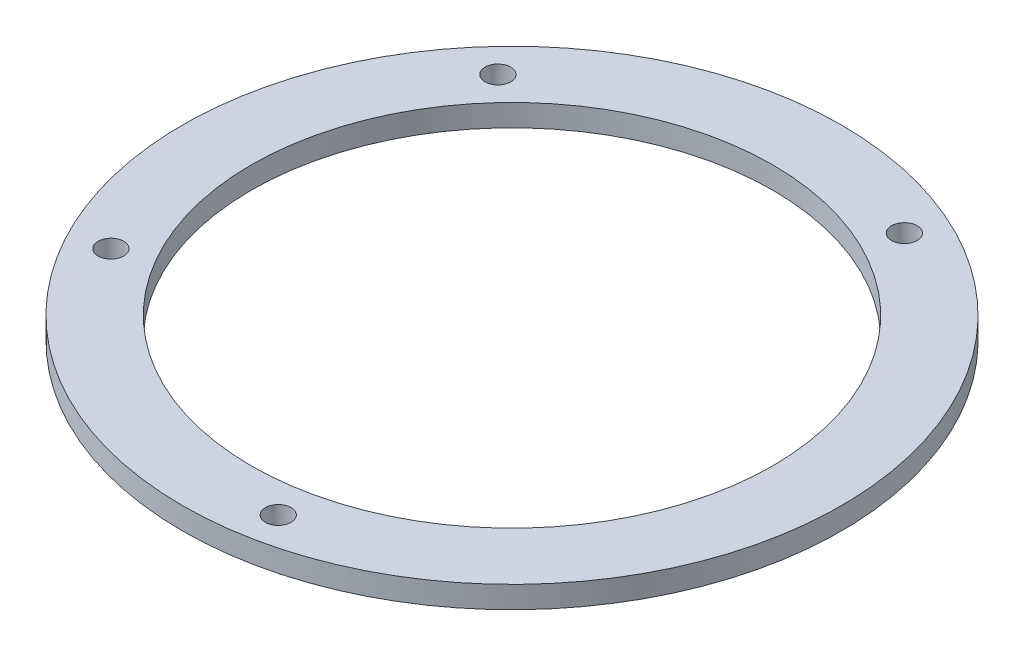
ISO-10303-21;
HEADER;
FILE_DESCRIPTION(('STEP AP214'),'2;1');
FILE_NAME('part.step','',(''),(''),'','','');
FILE_SCHEMA(('AUTOMOTIVE_DESIGN { 1 0 10303 214 1 1 1 1 }'));
ENDSEC;
DATA;
#1=APPLICATION_CONTEXT('core data for automotive mechanical design processes');
#2=APPLICATION_PROTOCOL_DEFINITION('international standard','automotive_design',2000,#1);
#3=PRODUCT_CONTEXT('',#1,'mechanical');
#4=PRODUCT('Part','Part','',(#3));
#5=PRODUCT_RELATED_PRODUCT_CATEGORY('part','',(#4));
#6=PRODUCT_DEFINITION_FORMATION('','',#4);
#7=PRODUCT_DEFINITION_CONTEXT('part definition',#1,'design');
#8=PRODUCT_DEFINITION('design','',#6,#7);
#9=PRODUCT_DEFINITION_SHAPE('','',#8);
#10=(LENGTH_UNIT() NAMED_UNIT(*) SI_UNIT(.MILLI.,.METRE.));
#11=(NAMED_UNIT(*) PLANE_ANGLE_UNIT() SI_UNIT($,.RADIAN.));
#12=(NAMED_UNIT(*) SI_UNIT($,.STERADIAN.) SOLID_ANGLE_UNIT());
#13=UNCERTAINTY_MEASURE_WITH_UNIT(LENGTH_MEASURE(1.E-05),#10,'distance_accuracy_value','');
#14=(GEOMETRIC_REPRESENTATION_CONTEXT(3) GLOBAL_UNCERTAINTY_ASSIGNED_CONTEXT((#13)) GLOBAL_UNIT_ASSIGNED_CONTEXT((#10,
#11,#12)) REPRESENTATION_CONTEXT('',''));
#15=CARTESIAN_POINT('',(0.,0.,0.));
#16=DIRECTION('',(0.,0.,1.));
#17=DIRECTION('',(1.,0.,0.));
#18=AXIS2_PLACEMENT_3D('',#15,#16,#17);
#19=CARTESIAN_POINT('',(0.,3.,0.));
#20=DIRECTION('',(0.,1.,0.));
#21=DIRECTION('',(0.,0.,1.));
#22=AXIS2_PLACEMENT_3D('',#19,#20,#21);
#23=PLANE('',#22);
#24=CARTESIAN_POINT('',(7.64824459419898,3.,39.5675922268125));
#25=DIRECTION('',(0.,1.,0.));
#26=DIRECTION('',(0.,0.,1.));
#27=AXIS2_PLACEMENT_3D('',#24,#25,#26);
#28=CIRCLE('',#27,1.75);
#29=CARTESIAN_POINT('',(7.64824459419898,3.,41.3175922268125));
#30=VERTEX_POINT('',#29);
#31=EDGE_CURVE('E59',#30,#30,#28,.T.);
#32=ORIENTED_EDGE('',*,*,#31,.F.);
#33=EDGE_LOOP('',(#32));
#34=FACE_BOUND('',#33,.T.);
#35=CARTESIAN_POINT('',(-29.444807033486,3.,-27.5153291595935));
#36=DIRECTION('',(0.,1.,0.));
#37=DIRECTION('',(0.,0.,1.));
#38=AXIS2_PLACEMENT_3D('',#35,#36,#37);
#39=CIRCLE('',#38,1.75);
#40=CARTESIAN_POINT('',(-29.444807033486,3.,-25.7653291595935));
#41=VERTEX_POINT('',#40);
#42=EDGE_CURVE('E47',#41,#41,#39,.T.);
#43=ORIENTED_EDGE('',*,*,#42,.F.);
#44=EDGE_LOOP('',(#43));
#45=FACE_BOUND('',#44,.T.);
#46=CARTESIAN_POINT('',(0.,3.,0.));
#47=DIRECTION('',(0.,1.,0.));
#48=DIRECTION('',(0.,0.,1.));
#49=AXIS2_PLACEMENT_3D('',#46,#47,#48);
#50=CIRCLE('',#49,45.);
#51=CARTESIAN_POINT('',(0.,3.,45.));
#52=VERTEX_POINT('',#51);
#53=EDGE_CURVE('E10',#52,#52,#50,.T.);
#54=ORIENTED_EDGE('',*,*,#53,.T.);
#55=EDGE_LOOP('',(#54));
#56=FACE_BOUND('',#55,.T.);
#57=CARTESIAN_POINT('',(0.,3.,0.));
#58=DIRECTION('',(0.,1.,0.));
#59=DIRECTION('',(0.,0.,1.));
#60=AXIS2_PLACEMENT_3D('',#57,#58,#59);
#61=CIRCLE('',#60,35.6);
#62=CARTESIAN_POINT('',(0.,3.,35.6));
#63=VERTEX_POINT('',#62);
#64=EDGE_CURVE('E42',#63,#63,#61,.T.);
#65=ORIENTED_EDGE('',*,*,#64,.F.);
#66=EDGE_LOOP('',(#65));
#67=FACE_BOUND('',#66,.T.);
#68=CARTESIAN_POINT('',(-35.2675788646756,3.,19.5009712841153));
#69=DIRECTION('',(0.,1.,0.));
#70=DIRECTION('',(0.,0.,1.));
#71=AXIS2_PLACEMENT_3D('',#68,#69,#70);
#72=CIRCLE('',#71,1.75);
#73=CARTESIAN_POINT('',(-35.2675788646756,3.,21.2509712841153));
#74=VERTEX_POINT('',#73);
#75=EDGE_CURVE('E53',#74,#74,#72,.T.);
#76=ORIENTED_EDGE('',*,*,#75,.F.);
#77=EDGE_LOOP('',(#76));
#78=FACE_BOUND('',#77,.T.);
#79=CARTESIAN_POINT('',(17.0696873257993,3.,-36.5063799163851));
#80=DIRECTION('',(0.,1.,0.));
#81=DIRECTION('',(0.,0.,1.));
#82=AXIS2_PLACEMENT_3D('',#79,#80,#81);
#83=CIRCLE('',#82,1.75);
#84=CARTESIAN_POINT('',(17.0696873257993,3.,-34.7563799163851));
#85=VERTEX_POINT('',#84);
#86=EDGE_CURVE('E65',#85,#85,#83,.T.);
#87=ORIENTED_EDGE('',*,*,#86,.F.);
#88=EDGE_LOOP('',(#87));
#89=FACE_BOUND('',#88,.T.);
#90=ADVANCED_FACE('F31',(#34,#45,#56,#67,#78,#89),#23,.T.);
#91=CARTESIAN_POINT('',(0.,0.,0.));
#92=DIRECTION('',(0.,1.,0.));
#93=DIRECTION('',(0.,0.,1.));
#94=AXIS2_PLACEMENT_3D('',#91,#92,#93);
#95=PLANE('',#94);
#96=CARTESIAN_POINT('',(0.,0.,0.));
#97=DIRECTION('',(0.,1.,0.));
#98=DIRECTION('',(0.,0.,1.));
#99=AXIS2_PLACEMENT_3D('',#96,#97,#98);
#100=CIRCLE('',#99,45.);
#101=CARTESIAN_POINT('',(0.,0.,45.));
#102=VERTEX_POINT('',#101);
#103=EDGE_CURVE('E35',#102,#102,#100,.T.);
#104=ORIENTED_EDGE('',*,*,#103,.F.);
#105=EDGE_LOOP('',(#104));
#106=FACE_BOUND('',#105,.T.);
#107=CARTESIAN_POINT('',(0.,0.,0.));
#108=DIRECTION('',(0.,1.,0.));
#109=DIRECTION('',(0.,0.,1.));
#110=AXIS2_PLACEMENT_3D('',#107,#108,#109);
#111=CIRCLE('',#110,35.6);
#112=CARTESIAN_POINT('',(0.,0.,35.6));
#113=VERTEX_POINT('',#112);
#114=EDGE_CURVE('E44',#113,#113,#111,.T.);
#115=ORIENTED_EDGE('',*,*,#114,.T.);
#116=EDGE_LOOP('',(#115));
#117=FACE_BOUND('',#116,.T.);
#118=CARTESIAN_POINT('',(-29.444807033486,0.,-27.5153291595935));
#119=DIRECTION('',(0.,1.,0.));
#120=DIRECTION('',(0.,0.,1.));
#121=AXIS2_PLACEMENT_3D('',#118,#119,#120);
#122=CIRCLE('',#121,1.75);
#123=CARTESIAN_POINT('',(-29.444807033486,0.,-25.7653291595935));
#124=VERTEX_POINT('',#123);
#125=EDGE_CURVE('E50',#124,#124,#122,.T.);
#126=ORIENTED_EDGE('',*,*,#125,.T.);
#127=EDGE_LOOP('',(#126));
#128=FACE_BOUND('',#127,.T.);
#129=CARTESIAN_POINT('',(-35.2675788646756,0.,19.5009712841153));
#130=DIRECTION('',(0.,1.,0.));
#131=DIRECTION('',(0.,0.,1.));
#132=AXIS2_PLACEMENT_3D('',#129,#130,#131);
#133=CIRCLE('',#132,1.75);
#134=CARTESIAN_POINT('',(-35.2675788646756,0.,21.2509712841153));
#135=VERTEX_POINT('',#134);
#136=EDGE_CURVE('E56',#135,#135,#133,.T.);
#137=ORIENTED_EDGE('',*,*,#136,.T.);
#138=EDGE_LOOP('',(#137));
#139=FACE_BOUND('',#138,.T.);
#140=CARTESIAN_POINT('',(7.64824459419898,0.,39.5675922268125));
#141=DIRECTION('',(0.,1.,0.));
#142=DIRECTION('',(0.,0.,1.));
#143=AXIS2_PLACEMENT_3D('',#140,#141,#142);
#144=CIRCLE('',#143,1.75);
#145=CARTESIAN_POINT('',(7.64824459419898,0.,41.3175922268125));
#146=VERTEX_POINT('',#145);
#147=EDGE_CURVE('E62',#146,#146,#144,.T.);
#148=ORIENTED_EDGE('',*,*,#147,.T.);
#149=EDGE_LOOP('',(#148));
#150=FACE_BOUND('',#149,.T.);
#151=CARTESIAN_POINT('',(17.0696873257993,0.,-36.5063799163851));
#152=DIRECTION('',(0.,1.,0.));
#153=DIRECTION('',(0.,0.,1.));
#154=AXIS2_PLACEMENT_3D('',#151,#152,#153);
#155=CIRCLE('',#154,1.75);
#156=CARTESIAN_POINT('',(17.0696873257993,0.,-34.7563799163851));
#157=VERTEX_POINT('',#156);
#158=EDGE_CURVE('E68',#157,#157,#155,.T.);
#159=ORIENTED_EDGE('',*,*,#158,.T.);
#160=EDGE_LOOP('',(#159));
#161=FACE_BOUND('',#160,.T.);
#162=ADVANCED_FACE('F78',(#106,#117,#128,#139,#150,#161),#95,.F.);
#163=CARTESIAN_POINT('',(0.,3.,0.));
#164=DIRECTION('',(0.,-1.,0.));
#165=DIRECTION('',(0.,0.,-1.));
#166=AXIS2_PLACEMENT_3D('',#163,#164,#165);
#167=CYLINDRICAL_SURFACE('',#166,45.);
#168=ORIENTED_EDGE('',*,*,#53,.F.);
#169=EDGE_LOOP('',(#168));
#170=FACE_BOUND('',#169,.T.);
#171=ORIENTED_EDGE('',*,*,#103,.T.);
#172=EDGE_LOOP('',(#171));
#173=FACE_BOUND('',#172,.T.);
#174=ADVANCED_FACE('F33',(#170,#173),#167,.T.);
#175=CARTESIAN_POINT('',(0.,3.,0.));
#176=DIRECTION('',(0.,-1.,0.));
#177=DIRECTION('',(0.,0.,-1.));
#178=AXIS2_PLACEMENT_3D('',#175,#176,#177);
#179=CYLINDRICAL_SURFACE('',#178,35.6);
#180=ORIENTED_EDGE('',*,*,#64,.T.);
#181=EDGE_LOOP('',(#180));
#182=FACE_BOUND('',#181,.T.);
#183=ORIENTED_EDGE('',*,*,#114,.F.);
#184=EDGE_LOOP('',(#183));
#185=FACE_BOUND('',#184,.T.);
#186=ADVANCED_FACE('F88',(#182,#185),#179,.F.);
#187=CARTESIAN_POINT('',(-29.444807033486,3.,-27.5153291595935));
#188=DIRECTION('',(0.,-1.,0.));
#189=DIRECTION('',(0.,0.,-1.));
#190=AXIS2_PLACEMENT_3D('',#187,#188,#189);
#191=CYLINDRICAL_SURFACE('',#190,1.75);
#192=ORIENTED_EDGE('',*,*,#42,.T.);
#193=EDGE_LOOP('',(#192));
#194=FACE_BOUND('',#193,.T.);
#195=ORIENTED_EDGE('',*,*,#125,.F.);
#196=EDGE_LOOP('',(#195));
#197=FACE_BOUND('',#196,.T.);
#198=ADVANCED_FACE('F91',(#194,#197),#191,.F.);
#199=CARTESIAN_POINT('',(-35.2675788646756,3.,19.5009712841153));
#200=DIRECTION('',(0.,-1.,0.));
#201=DIRECTION('',(0.,0.,-1.));
#202=AXIS2_PLACEMENT_3D('',#199,#200,#201);
#203=CYLINDRICAL_SURFACE('',#202,1.75);
#204=ORIENTED_EDGE('',*,*,#75,.T.);
#205=EDGE_LOOP('',(#204));
#206=FACE_BOUND('',#205,.T.);
#207=ORIENTED_EDGE('',*,*,#136,.F.);
#208=EDGE_LOOP('',(#207));
#209=FACE_BOUND('',#208,.T.);
#210=ADVANCED_FACE('F95',(#206,#209),#203,.F.);
#211=CARTESIAN_POINT('',(7.64824459419898,3.,39.5675922268125));
#212=DIRECTION('',(0.,-1.,0.));
#213=DIRECTION('',(0.,0.,-1.));
#214=AXIS2_PLACEMENT_3D('',#211,#212,#213);
#215=CYLINDRICAL_SURFACE('',#214,1.75);
#216=ORIENTED_EDGE('',*,*,#31,.T.);
#217=EDGE_LOOP('',(#216));
#218=FACE_BOUND('',#217,.T.);
#219=ORIENTED_EDGE('',*,*,#147,.F.);
#220=EDGE_LOOP('',(#219));
#221=FACE_BOUND('',#220,.T.);
#222=ADVANCED_FACE('F99',(#218,#221),#215,.F.);
#223=CARTESIAN_POINT('',(17.0696873257993,3.,-36.5063799163851));
#224=DIRECTION('',(0.,-1.,0.));
#225=DIRECTION('',(0.,0.,-1.));
#226=AXIS2_PLACEMENT_3D('',#223,#224,#225);
#227=CYLINDRICAL_SURFACE('',#226,1.75);
#228=ORIENTED_EDGE('',*,*,#86,.T.);
#229=EDGE_LOOP('',(#228));
#230=FACE_BOUND('',#229,.T.);
#231=ORIENTED_EDGE('',*,*,#158,.F.);
#232=EDGE_LOOP('',(#231));
#233=FACE_BOUND('',#232,.T.);
#234=ADVANCED_FACE('F74',(#230,#233),#227,.F.);
#235=CLOSED_SHELL('',(#90,#162,#174,#186,#198,#210,#222,#234));
#236=MANIFOLD_SOLID_BREP('B2',#235);
#237=ADVANCED_BREP_SHAPE_REPRESENTATION('',(#18,#236),#14);
#238=SHAPE_DEFINITION_REPRESENTATION(#9,#237);
ENDSEC;
END-ISO-10303-21;
